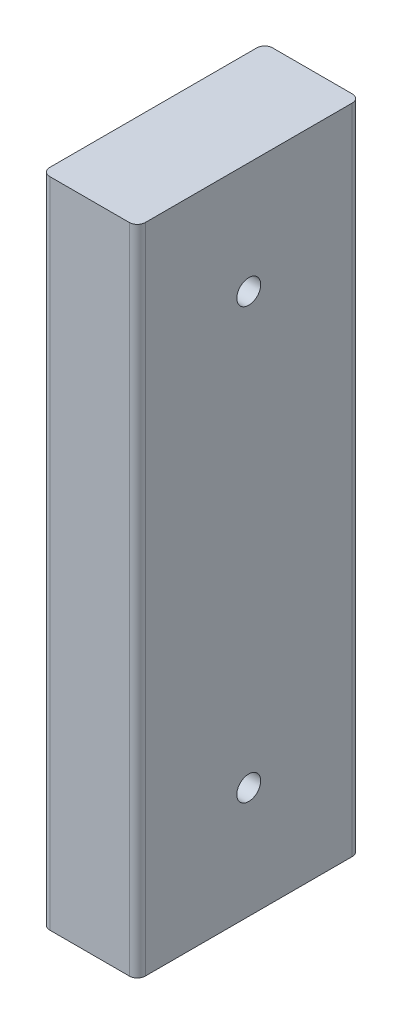
ISO-10303-21;
HEADER;
FILE_DESCRIPTION(('STEP AP214'),'2;1');
FILE_NAME('part.step','',(''),(''),'','','');
FILE_SCHEMA(('AUTOMOTIVE_DESIGN { 1 0 10303 214 1 1 1 1 }'));
ENDSEC;
DATA;
#1=APPLICATION_CONTEXT('core data for automotive mechanical design processes');
#2=APPLICATION_PROTOCOL_DEFINITION('international standard','automotive_design',2000,#1);
#3=PRODUCT_CONTEXT('',#1,'mechanical');
#4=PRODUCT('Part','Part','',(#3));
#5=PRODUCT_RELATED_PRODUCT_CATEGORY('part','',(#4));
#6=PRODUCT_DEFINITION_FORMATION('','',#4);
#7=PRODUCT_DEFINITION_CONTEXT('part definition',#1,'design');
#8=PRODUCT_DEFINITION('design','',#6,#7);
#9=PRODUCT_DEFINITION_SHAPE('','',#8);
#10=(LENGTH_UNIT() NAMED_UNIT(*) SI_UNIT(.MILLI.,.METRE.));
#11=(NAMED_UNIT(*) PLANE_ANGLE_UNIT() SI_UNIT($,.RADIAN.));
#12=(NAMED_UNIT(*) SI_UNIT($,.STERADIAN.) SOLID_ANGLE_UNIT());
#13=UNCERTAINTY_MEASURE_WITH_UNIT(LENGTH_MEASURE(1.E-05),#10,'distance_accuracy_value','');
#14=(GEOMETRIC_REPRESENTATION_CONTEXT(3) GLOBAL_UNCERTAINTY_ASSIGNED_CONTEXT((#13)) GLOBAL_UNIT_ASSIGNED_CONTEXT((#10,
#11,#12)) REPRESENTATION_CONTEXT('',''));
#15=CARTESIAN_POINT('',(0.,0.,0.));
#16=DIRECTION('',(0.,0.,1.));
#17=DIRECTION('',(1.,0.,0.));
#18=AXIS2_PLACEMENT_3D('',#15,#16,#17);
#19=CARTESIAN_POINT('',(19.05,0.,-88.9000000000001));
#20=DIRECTION('',(0.,1.,0.));
#21=DIRECTION('',(0.,0.,1.));
#22=AXIS2_PLACEMENT_3D('',#19,#20,#21);
#23=PLANE('',#22);
#24=DIRECTION('',(0.,0.,-1.));
#25=VECTOR('',#24,1.);
#26=CARTESIAN_POINT('',(-19.05,0.,-88.9000000000001));
#27=LINE('',#26,#25);
#28=CARTESIAN_POINT('',(-19.05,0.,-3.17500000000003));
#29=VERTEX_POINT('',#28);
#30=CARTESIAN_POINT('',(-19.05,0.,-85.7250000000001));
#31=VERTEX_POINT('',#30);
#32=EDGE_CURVE('E170',#29,#31,#27,.T.);
#33=ORIENTED_EDGE('',*,*,#32,.T.);
#34=CARTESIAN_POINT('',(-15.875,0.,-85.7250000000001));
#35=DIRECTION('',(0.,1.,0.));
#36=DIRECTION('',(0.,0.,1.));
#37=AXIS2_PLACEMENT_3D('',#34,#35,#36);
#38=CIRCLE('',#37,3.175);
#39=CARTESIAN_POINT('',(-15.875,0.,-88.9000000000001));
#40=VERTEX_POINT('',#39);
#41=EDGE_CURVE('E144',#31,#40,#38,.F.);
#42=ORIENTED_EDGE('',*,*,#41,.T.);
#43=DIRECTION('',(-1.,0.,0.));
#44=VECTOR('',#43,1.);
#45=CARTESIAN_POINT('',(19.05,0.,-88.9000000000001));
#46=LINE('',#45,#44);
#47=CARTESIAN_POINT('',(15.875,0.,-88.9000000000001));
#48=VERTEX_POINT('',#47);
#49=EDGE_CURVE('E123',#48,#40,#46,.T.);
#50=ORIENTED_EDGE('',*,*,#49,.F.);
#51=CARTESIAN_POINT('',(15.875,0.,-85.7250000000001));
#52=DIRECTION('',(0.,1.,0.));
#53=DIRECTION('',(0.,0.,1.));
#54=AXIS2_PLACEMENT_3D('',#51,#52,#53);
#55=CIRCLE('',#54,3.175);
#56=CARTESIAN_POINT('',(19.05,0.,-85.7250000000001));
#57=VERTEX_POINT('',#56);
#58=EDGE_CURVE('E128',#48,#57,#55,.F.);
#59=ORIENTED_EDGE('',*,*,#58,.T.);
#60=DIRECTION('',(0.,0.,-1.));
#61=VECTOR('',#60,1.);
#62=CARTESIAN_POINT('',(19.05,0.,-88.9000000000001));
#63=LINE('',#62,#61);
#64=CARTESIAN_POINT('',(19.05,0.,-3.17500000000003));
#65=VERTEX_POINT('',#64);
#66=EDGE_CURVE('E165',#65,#57,#63,.T.);
#67=ORIENTED_EDGE('',*,*,#66,.F.);
#68=CARTESIAN_POINT('',(15.875,0.,-3.175));
#69=DIRECTION('',(0.,1.,0.));
#70=DIRECTION('',(0.,0.,1.));
#71=AXIS2_PLACEMENT_3D('',#68,#69,#70);
#72=CIRCLE('',#71,3.175);
#73=CARTESIAN_POINT('',(15.875,0.,0.));
#74=VERTEX_POINT('',#73);
#75=EDGE_CURVE('E58',#65,#74,#72,.F.);
#76=ORIENTED_EDGE('',*,*,#75,.T.);
#77=DIRECTION('',(-1.,0.,0.));
#78=VECTOR('',#77,1.);
#79=CARTESIAN_POINT('',(19.05,0.,0.));
#80=LINE('',#79,#78);
#81=CARTESIAN_POINT('',(-15.875,0.,0.));
#82=VERTEX_POINT('',#81);
#83=EDGE_CURVE('E155',#74,#82,#80,.T.);
#84=ORIENTED_EDGE('',*,*,#83,.T.);
#85=CARTESIAN_POINT('',(-15.875,0.,-3.175));
#86=DIRECTION('',(0.,1.,0.));
#87=DIRECTION('',(0.,0.,1.));
#88=AXIS2_PLACEMENT_3D('',#85,#86,#87);
#89=CIRCLE('',#88,3.175);
#90=EDGE_CURVE('E51',#82,#29,#89,.F.);
#91=ORIENTED_EDGE('',*,*,#90,.T.);
#92=EDGE_LOOP('',(#33,#42,#50,#59,#67,#76,#84,#91));
#93=FACE_BOUND('',#92,.T.);
#94=ADVANCED_FACE('F36',(#93),#23,.F.);
#95=CARTESIAN_POINT('',(19.05,260.35,-88.9));
#96=DIRECTION('',(0.,0.,1.));
#97=DIRECTION('',(0.,-1.,0.));
#98=AXIS2_PLACEMENT_3D('',#95,#96,#97);
#99=PLANE('',#98);
#100=ORIENTED_EDGE('',*,*,#49,.T.);
#101=DIRECTION('',(0.,1.,0.));
#102=VECTOR('',#101,1.);
#103=CARTESIAN_POINT('',(-15.875,260.35,-88.9));
#104=LINE('',#103,#102);
#105=CARTESIAN_POINT('',(-15.875,260.35,-88.9));
#106=VERTEX_POINT('',#105);
#107=EDGE_CURVE('E122',#40,#106,#104,.T.);
#108=ORIENTED_EDGE('',*,*,#107,.T.);
#109=DIRECTION('',(-1.,0.,0.));
#110=VECTOR('',#109,1.);
#111=CARTESIAN_POINT('',(19.05,260.35,-88.9));
#112=LINE('',#111,#110);
#113=CARTESIAN_POINT('',(15.875,260.35,-88.9));
#114=VERTEX_POINT('',#113);
#115=EDGE_CURVE('E105',#114,#106,#112,.T.);
#116=ORIENTED_EDGE('',*,*,#115,.F.);
#117=DIRECTION('',(0.,1.,0.));
#118=VECTOR('',#117,1.);
#119=CARTESIAN_POINT('',(15.875,260.35,-88.9));
#120=LINE('',#119,#118);
#121=EDGE_CURVE('E119',#114,#48,#120,.F.);
#122=ORIENTED_EDGE('',*,*,#121,.T.);
#123=EDGE_LOOP('',(#100,#108,#116,#122));
#124=FACE_BOUND('',#123,.T.);
#125=ADVANCED_FACE('F118',(#124),#99,.F.);
#126=CARTESIAN_POINT('',(19.05,260.35,0.));
#127=DIRECTION('',(0.,-1.,0.));
#128=DIRECTION('',(0.,0.,-1.));
#129=AXIS2_PLACEMENT_3D('',#126,#127,#128);
#130=PLANE('',#129);
#131=ORIENTED_EDGE('',*,*,#115,.T.);
#132=CARTESIAN_POINT('',(-15.875,260.35,-85.725));
#133=DIRECTION('',(0.,-1.,0.));
#134=DIRECTION('',(0.,0.,-1.));
#135=AXIS2_PLACEMENT_3D('',#132,#133,#134);
#136=CIRCLE('',#135,3.175);
#137=CARTESIAN_POINT('',(-19.05,260.35,-85.725));
#138=VERTEX_POINT('',#137);
#139=EDGE_CURVE('E112',#106,#138,#136,.F.);
#140=ORIENTED_EDGE('',*,*,#139,.T.);
#141=DIRECTION('',(0.,0.,1.));
#142=VECTOR('',#141,1.);
#143=CARTESIAN_POINT('',(-19.05,260.35,0.));
#144=LINE('',#143,#142);
#145=CARTESIAN_POINT('',(-19.05,260.35,-3.175));
#146=VERTEX_POINT('',#145);
#147=EDGE_CURVE('E167',#138,#146,#144,.T.);
#148=ORIENTED_EDGE('',*,*,#147,.T.);
#149=CARTESIAN_POINT('',(-15.875,260.35,-3.175));
#150=DIRECTION('',(0.,-1.,0.));
#151=DIRECTION('',(0.,0.,-1.));
#152=AXIS2_PLACEMENT_3D('',#149,#150,#151);
#153=CIRCLE('',#152,3.175);
#154=CARTESIAN_POINT('',(-15.875,260.35,0.));
#155=VERTEX_POINT('',#154);
#156=EDGE_CURVE('E113',#146,#155,#153,.F.);
#157=ORIENTED_EDGE('',*,*,#156,.T.);
#158=DIRECTION('',(-1.,0.,0.));
#159=VECTOR('',#158,1.);
#160=CARTESIAN_POINT('',(19.05,260.35,0.));
#161=LINE('',#160,#159);
#162=CARTESIAN_POINT('',(15.875,260.35,0.));
#163=VERTEX_POINT('',#162);
#164=EDGE_CURVE('E124',#163,#155,#161,.T.);
#165=ORIENTED_EDGE('',*,*,#164,.F.);
#166=CARTESIAN_POINT('',(15.875,260.35,-3.175));
#167=DIRECTION('',(0.,-1.,0.));
#168=DIRECTION('',(0.,0.,-1.));
#169=AXIS2_PLACEMENT_3D('',#166,#167,#168);
#170=CIRCLE('',#169,3.175);
#171=CARTESIAN_POINT('',(19.05,260.35,-3.175));
#172=VERTEX_POINT('',#171);
#173=EDGE_CURVE('E130',#163,#172,#170,.F.);
#174=ORIENTED_EDGE('',*,*,#173,.T.);
#175=DIRECTION('',(0.,0.,1.));
#176=VECTOR('',#175,1.);
#177=CARTESIAN_POINT('',(19.05,260.35,0.));
#178=LINE('',#177,#176);
#179=CARTESIAN_POINT('',(19.05,260.35,-85.725));
#180=VERTEX_POINT('',#179);
#181=EDGE_CURVE('E107',#180,#172,#178,.T.);
#182=ORIENTED_EDGE('',*,*,#181,.F.);
#183=CARTESIAN_POINT('',(15.875,260.35,-85.725));
#184=DIRECTION('',(0.,-1.,0.));
#185=DIRECTION('',(0.,0.,-1.));
#186=AXIS2_PLACEMENT_3D('',#183,#184,#185);
#187=CIRCLE('',#186,3.175);
#188=EDGE_CURVE('E102',#180,#114,#187,.F.);
#189=ORIENTED_EDGE('',*,*,#188,.T.);
#190=EDGE_LOOP('',(#131,#140,#148,#157,#165,#174,#182,#189));
#191=FACE_BOUND('',#190,.T.);
#192=ADVANCED_FACE('F104',(#191),#130,.F.);
#193=CARTESIAN_POINT('',(19.05,0.,0.));
#194=DIRECTION('',(0.,0.,-1.));
#195=DIRECTION('',(-1.,0.,0.));
#196=AXIS2_PLACEMENT_3D('',#193,#194,#195);
#197=PLANE('',#196);
#198=ORIENTED_EDGE('',*,*,#164,.T.);
#199=DIRECTION('',(0.,-1.,0.));
#200=VECTOR('',#199,1.);
#201=CARTESIAN_POINT('',(-15.875,0.,0.));
#202=LINE('',#201,#200);
#203=EDGE_CURVE('E11',#155,#82,#202,.T.);
#204=ORIENTED_EDGE('',*,*,#203,.T.);
#205=ORIENTED_EDGE('',*,*,#83,.F.);
#206=DIRECTION('',(0.,-1.,0.));
#207=VECTOR('',#206,1.);
#208=CARTESIAN_POINT('',(15.875,0.,0.));
#209=LINE('',#208,#207);
#210=EDGE_CURVE('E44',#74,#163,#209,.F.);
#211=ORIENTED_EDGE('',*,*,#210,.T.);
#212=EDGE_LOOP('',(#198,#204,#205,#211));
#213=FACE_BOUND('',#212,.T.);
#214=ADVANCED_FACE('F154',(#213),#197,.F.);
#215=CARTESIAN_POINT('',(19.05,0.,0.));
#216=DIRECTION('',(-1.,0.,0.));
#217=DIRECTION('',(0.,0.,1.));
#218=AXIS2_PLACEMENT_3D('',#215,#216,#217);
#219=PLANE('',#218);
#220=CARTESIAN_POINT('',(19.05,215.9,-44.4500000000001));
#221=DIRECTION('',(-1.,0.,0.));
#222=DIRECTION('',(0.,0.,1.));
#223=AXIS2_PLACEMENT_3D('',#220,#221,#222);
#224=CIRCLE('',#223,4.7625);
#225=CARTESIAN_POINT('',(19.05,215.9,-39.6875000000001));
#226=VERTEX_POINT('',#225);
#227=EDGE_CURVE('E265',#226,#226,#224,.T.);
#228=ORIENTED_EDGE('',*,*,#227,.T.);
#229=EDGE_LOOP('',(#228));
#230=FACE_BOUND('',#229,.T.);
#231=CARTESIAN_POINT('',(19.05,44.45,-44.4500000000001));
#232=DIRECTION('',(-1.,0.,0.));
#233=DIRECTION('',(0.,0.,1.));
#234=AXIS2_PLACEMENT_3D('',#231,#232,#233);
#235=CIRCLE('',#234,4.76249999999999);
#236=CARTESIAN_POINT('',(19.05,44.45,-39.6875000000001));
#237=VERTEX_POINT('',#236);
#238=EDGE_CURVE('E173',#237,#237,#235,.T.);
#239=ORIENTED_EDGE('',*,*,#238,.T.);
#240=EDGE_LOOP('',(#239));
#241=FACE_BOUND('',#240,.T.);
#242=ORIENTED_EDGE('',*,*,#66,.T.);
#243=DIRECTION('',(0.,1.,0.));
#244=VECTOR('',#243,1.);
#245=CARTESIAN_POINT('',(19.05,0.,-85.7250000000001));
#246=LINE('',#245,#244);
#247=EDGE_CURVE('E149',#57,#180,#246,.T.);
#248=ORIENTED_EDGE('',*,*,#247,.T.);
#249=ORIENTED_EDGE('',*,*,#181,.T.);
#250=DIRECTION('',(0.,-1.,0.));
#251=VECTOR('',#250,1.);
#252=CARTESIAN_POINT('',(19.05,0.,-3.175));
#253=LINE('',#252,#251);
#254=EDGE_CURVE('E146',#172,#65,#253,.T.);
#255=ORIENTED_EDGE('',*,*,#254,.T.);
#256=EDGE_LOOP('',(#242,#248,#249,#255));
#257=FACE_BOUND('',#256,.T.);
#258=ADVANCED_FACE('F164',(#230,#241,#257),#219,.F.);
#259=CARTESIAN_POINT('',(-19.05,0.,0.));
#260=DIRECTION('',(-1.,0.,0.));
#261=DIRECTION('',(0.,0.,1.));
#262=AXIS2_PLACEMENT_3D('',#259,#260,#261);
#263=PLANE('',#262);
#264=CARTESIAN_POINT('',(-19.05,215.9,-44.4500000000001));
#265=DIRECTION('',(-1.,0.,0.));
#266=DIRECTION('',(0.,0.,1.));
#267=AXIS2_PLACEMENT_3D('',#264,#265,#266);
#268=CIRCLE('',#267,4.7625);
#269=CARTESIAN_POINT('',(-19.05,215.9,-39.6875000000001));
#270=VERTEX_POINT('',#269);
#271=EDGE_CURVE('E267',#270,#270,#268,.T.);
#272=ORIENTED_EDGE('',*,*,#271,.F.);
#273=EDGE_LOOP('',(#272));
#274=FACE_BOUND('',#273,.T.);
#275=CARTESIAN_POINT('',(-19.05,44.45,-44.4500000000001));
#276=DIRECTION('',(-1.,0.,0.));
#277=DIRECTION('',(0.,0.,1.));
#278=AXIS2_PLACEMENT_3D('',#275,#276,#277);
#279=CIRCLE('',#278,4.7625);
#280=CARTESIAN_POINT('',(-19.05,44.45,-39.6875000000001));
#281=VERTEX_POINT('',#280);
#282=EDGE_CURVE('E269',#281,#281,#279,.T.);
#283=ORIENTED_EDGE('',*,*,#282,.F.);
#284=EDGE_LOOP('',(#283));
#285=FACE_BOUND('',#284,.T.);
#286=ORIENTED_EDGE('',*,*,#147,.F.);
#287=DIRECTION('',(0.,1.,0.));
#288=VECTOR('',#287,1.);
#289=CARTESIAN_POINT('',(-19.05,0.,-85.7250000000001));
#290=LINE('',#289,#288);
#291=EDGE_CURVE('E139',#138,#31,#290,.F.);
#292=ORIENTED_EDGE('',*,*,#291,.T.);
#293=ORIENTED_EDGE('',*,*,#32,.F.);
#294=DIRECTION('',(0.,-1.,0.));
#295=VECTOR('',#294,1.);
#296=CARTESIAN_POINT('',(-19.05,260.35,-3.175));
#297=LINE('',#296,#295);
#298=EDGE_CURVE('E137',#29,#146,#297,.F.);
#299=ORIENTED_EDGE('',*,*,#298,.T.);
#300=EDGE_LOOP('',(#286,#292,#293,#299));
#301=FACE_BOUND('',#300,.T.);
#302=ADVANCED_FACE('F181',(#274,#285,#301),#263,.T.);
#303=CARTESIAN_POINT('',(-15.875,260.35,-85.725));
#304=DIRECTION('',(0.,-1.,0.));
#305=DIRECTION('',(0.,0.,-1.));
#306=AXIS2_PLACEMENT_3D('',#303,#304,#305);
#307=CYLINDRICAL_SURFACE('',#306,3.175);
#308=ORIENTED_EDGE('',*,*,#41,.F.);
#309=ORIENTED_EDGE('',*,*,#291,.F.);
#310=ORIENTED_EDGE('',*,*,#139,.F.);
#311=ORIENTED_EDGE('',*,*,#107,.F.);
#312=EDGE_LOOP('',(#308,#309,#310,#311));
#313=FACE_BOUND('',#312,.T.);
#314=ADVANCED_FACE('F190',(#313),#307,.T.);
#315=CARTESIAN_POINT('',(15.875,0.,-85.7250000000001));
#316=DIRECTION('',(0.,1.,0.));
#317=DIRECTION('',(0.,0.,1.));
#318=AXIS2_PLACEMENT_3D('',#315,#316,#317);
#319=CYLINDRICAL_SURFACE('',#318,3.175);
#320=ORIENTED_EDGE('',*,*,#58,.F.);
#321=ORIENTED_EDGE('',*,*,#121,.F.);
#322=ORIENTED_EDGE('',*,*,#188,.F.);
#323=ORIENTED_EDGE('',*,*,#247,.F.);
#324=EDGE_LOOP('',(#320,#321,#322,#323));
#325=FACE_BOUND('',#324,.T.);
#326=ADVANCED_FACE('F127',(#325),#319,.T.);
#327=CARTESIAN_POINT('',(-15.875,0.,-3.175));
#328=DIRECTION('',(0.,1.,0.));
#329=DIRECTION('',(0.,0.,1.));
#330=AXIS2_PLACEMENT_3D('',#327,#328,#329);
#331=CYLINDRICAL_SURFACE('',#330,3.175);
#332=ORIENTED_EDGE('',*,*,#156,.F.);
#333=ORIENTED_EDGE('',*,*,#298,.F.);
#334=ORIENTED_EDGE('',*,*,#90,.F.);
#335=ORIENTED_EDGE('',*,*,#203,.F.);
#336=EDGE_LOOP('',(#332,#333,#334,#335));
#337=FACE_BOUND('',#336,.T.);
#338=ADVANCED_FACE('F183',(#337),#331,.T.);
#339=CARTESIAN_POINT('',(15.875,0.,-3.175));
#340=DIRECTION('',(0.,-1.,0.));
#341=DIRECTION('',(0.,0.,-1.));
#342=AXIS2_PLACEMENT_3D('',#339,#340,#341);
#343=CYLINDRICAL_SURFACE('',#342,3.175);
#344=ORIENTED_EDGE('',*,*,#173,.F.);
#345=ORIENTED_EDGE('',*,*,#210,.F.);
#346=ORIENTED_EDGE('',*,*,#75,.F.);
#347=ORIENTED_EDGE('',*,*,#254,.F.);
#348=EDGE_LOOP('',(#344,#345,#346,#347));
#349=FACE_BOUND('',#348,.T.);
#350=ADVANCED_FACE('F38',(#349),#343,.T.);
#351=CARTESIAN_POINT('',(-19.05,44.45,-44.4500000000001));
#352=DIRECTION('',(-1.,0.,0.));
#353=DIRECTION('',(0.,0.,1.));
#354=AXIS2_PLACEMENT_3D('',#351,#352,#353);
#355=CYLINDRICAL_SURFACE('',#354,4.76249999999999);
#356=ORIENTED_EDGE('',*,*,#238,.F.);
#357=EDGE_LOOP('',(#356));
#358=FACE_BOUND('',#357,.T.);
#359=ORIENTED_EDGE('',*,*,#282,.T.);
#360=EDGE_LOOP('',(#359));
#361=FACE_BOUND('',#360,.T.);
#362=ADVANCED_FACE('F189',(#358,#361),#355,.F.);
#363=CARTESIAN_POINT('',(-19.05,215.9,-44.4500000000001));
#364=DIRECTION('',(-1.,0.,0.));
#365=DIRECTION('',(0.,0.,1.));
#366=AXIS2_PLACEMENT_3D('',#363,#364,#365);
#367=CYLINDRICAL_SURFACE('',#366,4.7625);
#368=ORIENTED_EDGE('',*,*,#227,.F.);
#369=EDGE_LOOP('',(#368));
#370=FACE_BOUND('',#369,.T.);
#371=ORIENTED_EDGE('',*,*,#271,.T.);
#372=EDGE_LOOP('',(#371));
#373=FACE_BOUND('',#372,.T.);
#374=ADVANCED_FACE('F249',(#370,#373),#367,.F.);
#375=CLOSED_SHELL('',(#94,#125,#192,#214,#258,#302,#314,#326,#338,#350,#362,#374));
#376=MANIFOLD_SOLID_BREP('B2',#375);
#377=ADVANCED_BREP_SHAPE_REPRESENTATION('',(#18,#376),#14);
#378=SHAPE_DEFINITION_REPRESENTATION(#9,#377);
ENDSEC;
END-ISO-10303-21;
